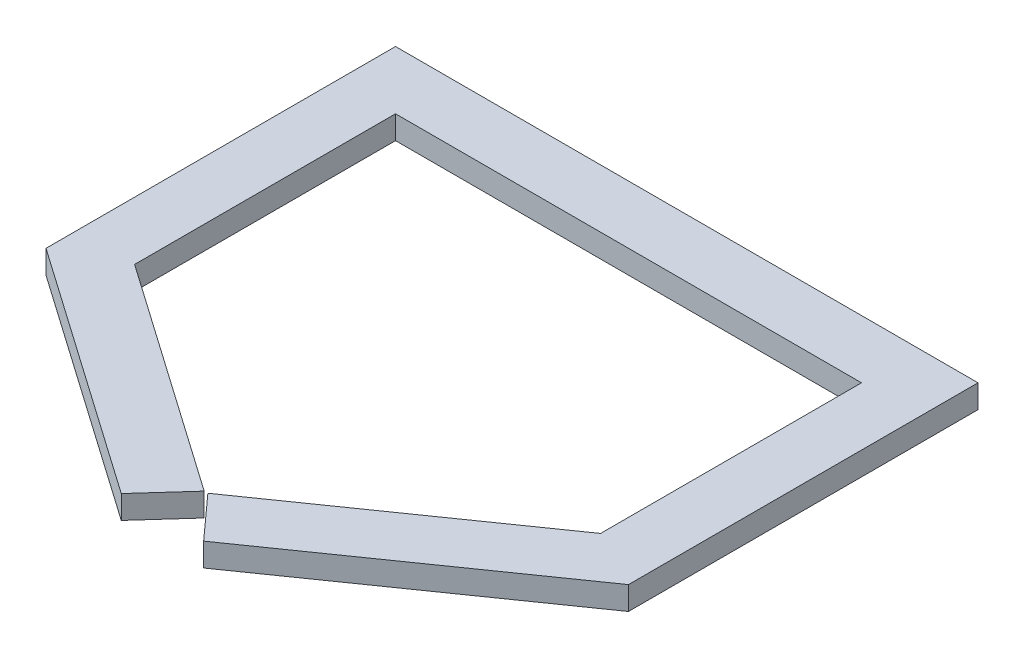
ISO-10303-21;
HEADER;
FILE_DESCRIPTION(('STEP AP214'),'2;1');
FILE_NAME('part.step','',(''),(''),'','','');
FILE_SCHEMA(('AUTOMOTIVE_DESIGN { 1 0 10303 214 1 1 1 1 }'));
ENDSEC;
DATA;
#1=APPLICATION_CONTEXT('core data for automotive mechanical design processes');
#2=APPLICATION_PROTOCOL_DEFINITION('international standard','automotive_design',2000,#1);
#3=PRODUCT_CONTEXT('',#1,'mechanical');
#4=PRODUCT('Part','Part','',(#3));
#5=PRODUCT_RELATED_PRODUCT_CATEGORY('part','',(#4));
#6=PRODUCT_DEFINITION_FORMATION('','',#4);
#7=PRODUCT_DEFINITION_CONTEXT('part definition',#1,'design');
#8=PRODUCT_DEFINITION('design','',#6,#7);
#9=PRODUCT_DEFINITION_SHAPE('','',#8);
#10=(LENGTH_UNIT() NAMED_UNIT(*) SI_UNIT(.MILLI.,.METRE.));
#11=(NAMED_UNIT(*) PLANE_ANGLE_UNIT() SI_UNIT($,.RADIAN.));
#12=(NAMED_UNIT(*) SI_UNIT($,.STERADIAN.) SOLID_ANGLE_UNIT());
#13=UNCERTAINTY_MEASURE_WITH_UNIT(LENGTH_MEASURE(1.E-05),#10,'distance_accuracy_value','');
#14=(GEOMETRIC_REPRESENTATION_CONTEXT(3) GLOBAL_UNCERTAINTY_ASSIGNED_CONTEXT((#13)) GLOBAL_UNIT_ASSIGNED_CONTEXT((#10,
#11,#12)) REPRESENTATION_CONTEXT('',''));
#15=CARTESIAN_POINT('',(0.,0.,0.));
#16=DIRECTION('',(0.,0.,1.));
#17=DIRECTION('',(1.,0.,0.));
#18=AXIS2_PLACEMENT_3D('',#15,#16,#17);
#19=CARTESIAN_POINT('',(-19.9955,2.,4.89453439352675));
#20=DIRECTION('',(-0.572898281778328,0.,0.819626475130861));
#21=DIRECTION('',(0.819626475130861,0.,0.572898281778328));
#22=AXIS2_PLACEMENT_3D('',#19,#20,#21);
#23=PLANE('',#22);
#24=DIRECTION('',(-0.819626475130861,0.,-0.572898281778328));
#25=VECTOR('',#24,1.);
#26=CARTESIAN_POINT('',(-19.9955,0.,4.89453439352675));
#27=LINE('',#26,#25);
#28=CARTESIAN_POINT('',(-0.158102293717703,0.,18.7603762199123));
#29=VERTEX_POINT('',#28);
#30=CARTESIAN_POINT('',(-19.9955,0.,4.89453439352675));
#31=VERTEX_POINT('',#30);
#32=EDGE_CURVE('E104',#29,#31,#27,.T.);
#33=ORIENTED_EDGE('',*,*,#32,.T.);
#34=DIRECTION('',(0.,-1.,0.));
#35=VECTOR('',#34,1.);
#36=CARTESIAN_POINT('',(-19.9955,2.,4.89453439352675));
#37=LINE('',#36,#35);
#38=CARTESIAN_POINT('',(-19.9955,2.,4.89453439352675));
#39=VERTEX_POINT('',#38);
#40=EDGE_CURVE('E11',#39,#31,#37,.T.);
#41=ORIENTED_EDGE('',*,*,#40,.F.);
#42=DIRECTION('',(-0.819626475130861,0.,-0.572898281778327));
#43=VECTOR('',#42,1.);
#44=CARTESIAN_POINT('',(-1.9612805390056,2.,17.5));
#45=LINE('',#44,#43);
#46=CARTESIAN_POINT('',(-0.158102293717703,2.,18.7603762199123));
#47=VERTEX_POINT('',#46);
#48=EDGE_CURVE('E110',#47,#39,#45,.T.);
#49=ORIENTED_EDGE('',*,*,#48,.F.);
#50=DIRECTION('',(0.,-1.,0.));
#51=VECTOR('',#50,1.);
#52=CARTESIAN_POINT('',(-0.158102293717703,2.,18.7603762199123));
#53=LINE('',#52,#51);
#54=EDGE_CURVE('E160',#47,#29,#53,.T.);
#55=ORIENTED_EDGE('',*,*,#54,.T.);
#56=EDGE_LOOP('',(#33,#41,#49,#55));
#57=FACE_BOUND('',#56,.T.);
#58=ADVANCED_FACE('F39',(#57),#23,.F.);
#59=CARTESIAN_POINT('',(-19.9955,2.,-17.5));
#60=DIRECTION('',(-1.,0.,0.));
#61=DIRECTION('',(0.,0.,1.));
#62=AXIS2_PLACEMENT_3D('',#59,#60,#61);
#63=PLANE('',#62);
#64=DIRECTION('',(0.,0.,-1.));
#65=VECTOR('',#64,1.);
#66=CARTESIAN_POINT('',(-19.9955,0.,-17.5));
#67=LINE('',#66,#65);
#68=CARTESIAN_POINT('',(-19.9955,0.,-17.5));
#69=VERTEX_POINT('',#68);
#70=EDGE_CURVE('E166',#31,#69,#67,.T.);
#71=ORIENTED_EDGE('',*,*,#70,.T.);
#72=DIRECTION('',(0.,-1.,0.));
#73=VECTOR('',#72,1.);
#74=CARTESIAN_POINT('',(-19.9955,2.,-17.5));
#75=LINE('',#74,#73);
#76=CARTESIAN_POINT('',(-19.9955,2.,-17.5));
#77=VERTEX_POINT('',#76);
#78=EDGE_CURVE('E48',#77,#69,#75,.T.);
#79=ORIENTED_EDGE('',*,*,#78,.F.);
#80=DIRECTION('',(0.,0.,-1.));
#81=VECTOR('',#80,1.);
#82=CARTESIAN_POINT('',(-19.9955,2.,-17.5));
#83=LINE('',#82,#81);
#84=EDGE_CURVE('E282',#39,#77,#83,.T.);
#85=ORIENTED_EDGE('',*,*,#84,.F.);
#86=ORIENTED_EDGE('',*,*,#40,.T.);
#87=EDGE_LOOP('',(#71,#79,#85,#86));
#88=FACE_BOUND('',#87,.T.);
#89=ADVANCED_FACE('F287',(#88),#63,.F.);
#90=CARTESIAN_POINT('',(-19.9955,2.,-17.5));
#91=DIRECTION('',(0.,0.,-1.));
#92=DIRECTION('',(-1.,0.,0.));
#93=AXIS2_PLACEMENT_3D('',#90,#91,#92);
#94=PLANE('',#93);
#95=DIRECTION('',(1.,0.,0.));
#96=VECTOR('',#95,1.);
#97=CARTESIAN_POINT('',(-19.9955,0.,-17.5));
#98=LINE('',#97,#96);
#99=CARTESIAN_POINT('',(20.,0.,-17.5));
#100=VERTEX_POINT('',#99);
#101=EDGE_CURVE('E169',#69,#100,#98,.T.);
#102=ORIENTED_EDGE('',*,*,#101,.T.);
#103=DIRECTION('',(0.,-1.,0.));
#104=VECTOR('',#103,1.);
#105=CARTESIAN_POINT('',(20.,2.,-17.5));
#106=LINE('',#105,#104);
#107=CARTESIAN_POINT('',(20.,2.,-17.5));
#108=VERTEX_POINT('',#107);
#109=EDGE_CURVE('E225',#108,#100,#106,.T.);
#110=ORIENTED_EDGE('',*,*,#109,.F.);
#111=DIRECTION('',(1.,0.,0.));
#112=VECTOR('',#111,1.);
#113=CARTESIAN_POINT('',(-19.9955,2.,-17.5));
#114=LINE('',#113,#112);
#115=EDGE_CURVE('E236',#77,#108,#114,.T.);
#116=ORIENTED_EDGE('',*,*,#115,.F.);
#117=ORIENTED_EDGE('',*,*,#78,.T.);
#118=EDGE_LOOP('',(#102,#110,#116,#117));
#119=FACE_BOUND('',#118,.T.);
#120=ADVANCED_FACE('F234',(#119),#94,.F.);
#121=CARTESIAN_POINT('',(20.,2.,-17.5));
#122=DIRECTION('',(1.,0.,0.));
#123=DIRECTION('',(0.,0.,-1.));
#124=AXIS2_PLACEMENT_3D('',#121,#122,#123);
#125=PLANE('',#124);
#126=DIRECTION('',(0.,0.,1.));
#127=VECTOR('',#126,1.);
#128=CARTESIAN_POINT('',(20.,0.,-17.5));
#129=LINE('',#128,#127);
#130=CARTESIAN_POINT('',(20.,0.,4.89422142863211));
#131=VERTEX_POINT('',#130);
#132=EDGE_CURVE('E172',#100,#131,#129,.T.);
#133=ORIENTED_EDGE('',*,*,#132,.T.);
#134=DIRECTION('',(0.,-1.,0.));
#135=VECTOR('',#134,1.);
#136=CARTESIAN_POINT('',(20.,2.,4.89422142863211));
#137=LINE('',#136,#135);
#138=CARTESIAN_POINT('',(20.,2.,4.89422142863211));
#139=VERTEX_POINT('',#138);
#140=EDGE_CURVE('E221',#139,#131,#137,.T.);
#141=ORIENTED_EDGE('',*,*,#140,.F.);
#142=DIRECTION('',(0.,0.,1.));
#143=VECTOR('',#142,1.);
#144=CARTESIAN_POINT('',(20.,2.,-17.5));
#145=LINE('',#144,#143);
#146=EDGE_CURVE('E254',#108,#139,#145,.T.);
#147=ORIENTED_EDGE('',*,*,#146,.F.);
#148=ORIENTED_EDGE('',*,*,#109,.T.);
#149=EDGE_LOOP('',(#133,#141,#147,#148));
#150=FACE_BOUND('',#149,.T.);
#151=ADVANCED_FACE('F244',(#150),#125,.F.);
#152=CARTESIAN_POINT('',(1.96155105699159,2.,17.5));
#153=DIRECTION('',(0.572817586887448,0.,0.819682872916374));
#154=DIRECTION('',(0.819682872916374,0.,-0.572817586887448));
#155=AXIS2_PLACEMENT_3D('',#152,#153,#154);
#156=PLANE('',#155);
#157=DIRECTION('',(-0.819682872916374,0.,0.572817586887448));
#158=VECTOR('',#157,1.);
#159=CARTESIAN_POINT('',(1.96155105699159,0.,17.5));
#160=LINE('',#159,#158);
#161=CARTESIAN_POINT('',(0.157994698837727,0.,18.7603762199123));
#162=VERTEX_POINT('',#161);
#163=EDGE_CURVE('E176',#131,#162,#160,.T.);
#164=ORIENTED_EDGE('',*,*,#163,.T.);
#165=DIRECTION('',(0.,-1.,0.));
#166=VECTOR('',#165,1.);
#167=CARTESIAN_POINT('',(0.157994698837727,2.,18.7603762199123));
#168=LINE('',#167,#166);
#169=CARTESIAN_POINT('',(0.157994698837727,2.,18.7603762199123));
#170=VERTEX_POINT('',#169);
#171=EDGE_CURVE('E217',#170,#162,#168,.T.);
#172=ORIENTED_EDGE('',*,*,#171,.F.);
#173=DIRECTION('',(-0.819682872916375,0.,0.572817586887447));
#174=VECTOR('',#173,1.);
#175=CARTESIAN_POINT('',(1.96155105699159,2.,17.5));
#176=LINE('',#175,#174);
#177=EDGE_CURVE('E250',#139,#170,#176,.T.);
#178=ORIENTED_EDGE('',*,*,#177,.F.);
#179=ORIENTED_EDGE('',*,*,#140,.T.);
#180=EDGE_LOOP('',(#164,#172,#178,#179));
#181=FACE_BOUND('',#180,.T.);
#182=ADVANCED_FACE('F248',(#181),#156,.F.);
#183=CARTESIAN_POINT('',(0.157994698837727,2.,18.7603762199123));
#184=DIRECTION('',(0.742124300269146,0.,-0.670262279223611));
#185=DIRECTION('',(-0.670262279223611,0.,-0.742124300269146));
#186=AXIS2_PLACEMENT_3D('',#183,#184,#185);
#187=PLANE('',#186);
#188=DIRECTION('',(0.670262279223611,0.,0.742124300269146));
#189=VECTOR('',#188,1.);
#190=CARTESIAN_POINT('',(0.157994698837727,0.,18.7603762199123));
#191=LINE('',#190,#189);
#192=CARTESIAN_POINT('',(3.5355,0.,22.5));
#193=VERTEX_POINT('',#192);
#194=EDGE_CURVE('E179',#162,#193,#191,.T.);
#195=ORIENTED_EDGE('',*,*,#194,.T.);
#196=DIRECTION('',(0.,-1.,0.));
#197=VECTOR('',#196,1.);
#198=CARTESIAN_POINT('',(3.5355,2.,22.5));
#199=LINE('',#198,#197);
#200=CARTESIAN_POINT('',(3.5355,2.,22.5));
#201=VERTEX_POINT('',#200);
#202=EDGE_CURVE('E213',#201,#193,#199,.T.);
#203=ORIENTED_EDGE('',*,*,#202,.F.);
#204=DIRECTION('',(0.670262279223611,0.,0.742124300269146));
#205=VECTOR('',#204,1.);
#206=CARTESIAN_POINT('',(0.157994698837727,2.,18.7603762199123));
#207=LINE('',#206,#205);
#208=EDGE_CURVE('E253',#170,#201,#207,.T.);
#209=ORIENTED_EDGE('',*,*,#208,.F.);
#210=ORIENTED_EDGE('',*,*,#171,.T.);
#211=EDGE_LOOP('',(#195,#203,#209,#210));
#212=FACE_BOUND('',#211,.T.);
#213=ADVANCED_FACE('F299',(#212),#187,.F.);
#214=CARTESIAN_POINT('',(3.5355,2.,22.5));
#215=DIRECTION('',(-0.572817586887447,0.,-0.819682872916375));
#216=DIRECTION('',(-0.819682872916375,0.,0.572817586887447));
#217=AXIS2_PLACEMENT_3D('',#214,#215,#216);
#218=PLANE('',#217);
#219=DIRECTION('',(0.819682872916375,0.,-0.572817586887447));
#220=VECTOR('',#219,1.);
#221=CARTESIAN_POINT('',(3.5355,0.,22.5));
#222=LINE('',#221,#220);
#223=CARTESIAN_POINT('',(25.,0.,7.5));
#224=VERTEX_POINT('',#223);
#225=EDGE_CURVE('E182',#193,#224,#222,.T.);
#226=ORIENTED_EDGE('',*,*,#225,.T.);
#227=DIRECTION('',(0.,-1.,0.));
#228=VECTOR('',#227,1.);
#229=CARTESIAN_POINT('',(25.,2.,7.5));
#230=LINE('',#229,#228);
#231=CARTESIAN_POINT('',(25.,2.,7.5));
#232=VERTEX_POINT('',#231);
#233=EDGE_CURVE('E209',#232,#224,#230,.T.);
#234=ORIENTED_EDGE('',*,*,#233,.F.);
#235=DIRECTION('',(0.819682872916375,0.,-0.572817586887447));
#236=VECTOR('',#235,1.);
#237=CARTESIAN_POINT('',(3.5355,2.,22.5));
#238=LINE('',#237,#236);
#239=EDGE_CURVE('E258',#201,#232,#238,.T.);
#240=ORIENTED_EDGE('',*,*,#239,.F.);
#241=ORIENTED_EDGE('',*,*,#202,.T.);
#242=EDGE_LOOP('',(#226,#234,#240,#241));
#243=FACE_BOUND('',#242,.T.);
#244=ADVANCED_FACE('F302',(#243),#218,.F.);
#245=CARTESIAN_POINT('',(25.,2.,-22.5));
#246=DIRECTION('',(-1.,0.,0.));
#247=DIRECTION('',(0.,0.,1.));
#248=AXIS2_PLACEMENT_3D('',#245,#246,#247);
#249=PLANE('',#248);
#250=DIRECTION('',(0.,0.,-1.));
#251=VECTOR('',#250,1.);
#252=CARTESIAN_POINT('',(25.,0.,-22.5));
#253=LINE('',#252,#251);
#254=CARTESIAN_POINT('',(25.,0.,-22.5));
#255=VERTEX_POINT('',#254);
#256=EDGE_CURVE('E185',#224,#255,#253,.T.);
#257=ORIENTED_EDGE('',*,*,#256,.T.);
#258=DIRECTION('',(0.,-1.,0.));
#259=VECTOR('',#258,1.);
#260=CARTESIAN_POINT('',(25.,2.,-22.5));
#261=LINE('',#260,#259);
#262=CARTESIAN_POINT('',(25.,2.,-22.5));
#263=VERTEX_POINT('',#262);
#264=EDGE_CURVE('E205',#263,#255,#261,.T.);
#265=ORIENTED_EDGE('',*,*,#264,.F.);
#266=DIRECTION('',(0.,0.,-1.));
#267=VECTOR('',#266,1.);
#268=CARTESIAN_POINT('',(25.,2.,-22.5));
#269=LINE('',#268,#267);
#270=EDGE_CURVE('E265',#232,#263,#269,.T.);
#271=ORIENTED_EDGE('',*,*,#270,.F.);
#272=ORIENTED_EDGE('',*,*,#233,.T.);
#273=EDGE_LOOP('',(#257,#265,#271,#272));
#274=FACE_BOUND('',#273,.T.);
#275=ADVANCED_FACE('F273',(#274),#249,.F.);
#276=CARTESIAN_POINT('',(-24.9955,2.,-22.5));
#277=DIRECTION('',(0.,0.,1.));
#278=DIRECTION('',(1.,0.,0.));
#279=AXIS2_PLACEMENT_3D('',#276,#277,#278);
#280=PLANE('',#279);
#281=DIRECTION('',(-1.,0.,0.));
#282=VECTOR('',#281,1.);
#283=CARTESIAN_POINT('',(-24.9955,0.,-22.5));
#284=LINE('',#283,#282);
#285=CARTESIAN_POINT('',(-24.9955,0.,-22.5));
#286=VERTEX_POINT('',#285);
#287=EDGE_CURVE('E188',#255,#286,#284,.T.);
#288=ORIENTED_EDGE('',*,*,#287,.T.);
#289=DIRECTION('',(0.,-1.,0.));
#290=VECTOR('',#289,1.);
#291=CARTESIAN_POINT('',(-24.9955,2.,-22.5));
#292=LINE('',#291,#290);
#293=CARTESIAN_POINT('',(-24.9955,2.,-22.5));
#294=VERTEX_POINT('',#293);
#295=EDGE_CURVE('E153',#294,#286,#292,.T.);
#296=ORIENTED_EDGE('',*,*,#295,.F.);
#297=DIRECTION('',(-1.,0.,0.));
#298=VECTOR('',#297,1.);
#299=CARTESIAN_POINT('',(-24.9955,2.,-22.5));
#300=LINE('',#299,#298);
#301=EDGE_CURVE('E142',#263,#294,#300,.T.);
#302=ORIENTED_EDGE('',*,*,#301,.F.);
#303=ORIENTED_EDGE('',*,*,#264,.T.);
#304=EDGE_LOOP('',(#288,#296,#302,#303));
#305=FACE_BOUND('',#304,.T.);
#306=ADVANCED_FACE('F277',(#305),#280,.F.);
#307=CARTESIAN_POINT('',(-24.9955,2.,-22.5));
#308=DIRECTION('',(1.,0.,0.));
#309=DIRECTION('',(0.,0.,-1.));
#310=AXIS2_PLACEMENT_3D('',#307,#308,#309);
#311=PLANE('',#310);
#312=DIRECTION('',(0.,0.,1.));
#313=VECTOR('',#312,1.);
#314=CARTESIAN_POINT('',(-24.9955,0.,-22.5));
#315=LINE('',#314,#313);
#316=CARTESIAN_POINT('',(-24.9955,0.,7.5));
#317=VERTEX_POINT('',#316);
#318=EDGE_CURVE('E151',#286,#317,#315,.T.);
#319=ORIENTED_EDGE('',*,*,#318,.T.);
#320=DIRECTION('',(0.,-1.,0.));
#321=VECTOR('',#320,1.);
#322=CARTESIAN_POINT('',(-24.9955,2.,7.5));
#323=LINE('',#322,#321);
#324=CARTESIAN_POINT('',(-24.9955,2.,7.5));
#325=VERTEX_POINT('',#324);
#326=EDGE_CURVE('E148',#325,#317,#323,.T.);
#327=ORIENTED_EDGE('',*,*,#326,.F.);
#328=DIRECTION('',(0.,0.,1.));
#329=VECTOR('',#328,1.);
#330=CARTESIAN_POINT('',(-24.9955,2.,-22.5));
#331=LINE('',#330,#329);
#332=EDGE_CURVE('E136',#294,#325,#331,.T.);
#333=ORIENTED_EDGE('',*,*,#332,.F.);
#334=ORIENTED_EDGE('',*,*,#295,.T.);
#335=EDGE_LOOP('',(#319,#327,#333,#334));
#336=FACE_BOUND('',#335,.T.);
#337=ADVANCED_FACE('F149',(#336),#311,.F.);
#338=CARTESIAN_POINT('',(-24.9955,2.,7.5));
#339=DIRECTION('',(0.572898281778328,0.,-0.819626475130861));
#340=DIRECTION('',(-0.819626475130861,0.,-0.572898281778328));
#341=AXIS2_PLACEMENT_3D('',#338,#339,#340);
#342=PLANE('',#341);
#343=DIRECTION('',(0.819626475130861,0.,0.572898281778328));
#344=VECTOR('',#343,1.);
#345=CARTESIAN_POINT('',(-24.9955,0.,7.5));
#346=LINE('',#345,#344);
#347=CARTESIAN_POINT('',(-3.53549999999999,0.,22.5));
#348=VERTEX_POINT('',#347);
#349=EDGE_CURVE('E97',#317,#348,#346,.T.);
#350=ORIENTED_EDGE('',*,*,#349,.T.);
#351=DIRECTION('',(0.,-1.,0.));
#352=VECTOR('',#351,1.);
#353=CARTESIAN_POINT('',(-3.53549999999999,2.,22.5));
#354=LINE('',#353,#352);
#355=CARTESIAN_POINT('',(-3.53549999999999,2.,22.5));
#356=VERTEX_POINT('',#355);
#357=EDGE_CURVE('E154',#356,#348,#354,.T.);
#358=ORIENTED_EDGE('',*,*,#357,.F.);
#359=DIRECTION('',(0.819626475130861,0.,0.572898281778328));
#360=VECTOR('',#359,1.);
#361=CARTESIAN_POINT('',(-24.9955,2.,7.5));
#362=LINE('',#361,#360);
#363=EDGE_CURVE('E140',#325,#356,#362,.T.);
#364=ORIENTED_EDGE('',*,*,#363,.F.);
#365=ORIENTED_EDGE('',*,*,#326,.T.);
#366=EDGE_LOOP('',(#350,#358,#364,#365));
#367=FACE_BOUND('',#366,.T.);
#368=ADVANCED_FACE('F156',(#367),#342,.F.);
#369=CARTESIAN_POINT('',(-0.158102293717703,2.,18.7603762199123));
#370=DIRECTION('',(-0.742134921239146,0.,-0.670250519341363));
#371=DIRECTION('',(-0.670250519341363,0.,0.742134921239146));
#372=AXIS2_PLACEMENT_3D('',#369,#370,#371);
#373=PLANE('',#372);
#374=DIRECTION('',(0.670250519341363,0.,-0.742134921239146));
#375=VECTOR('',#374,1.);
#376=CARTESIAN_POINT('',(-0.158102293717703,0.,18.7603762199123));
#377=LINE('',#376,#375);
#378=EDGE_CURVE('E195',#348,#29,#377,.T.);
#379=ORIENTED_EDGE('',*,*,#378,.T.);
#380=ORIENTED_EDGE('',*,*,#54,.F.);
#381=DIRECTION('',(0.670250519341363,0.,-0.742134921239146));
#382=VECTOR('',#381,1.);
#383=CARTESIAN_POINT('',(-0.158102293717703,2.,18.7603762199123));
#384=LINE('',#383,#382);
#385=EDGE_CURVE('E56',#356,#47,#384,.T.);
#386=ORIENTED_EDGE('',*,*,#385,.F.);
#387=ORIENTED_EDGE('',*,*,#357,.T.);
#388=EDGE_LOOP('',(#379,#380,#386,#387));
#389=FACE_BOUND('',#388,.T.);
#390=ADVANCED_FACE('F279',(#389),#373,.F.);
#391=CARTESIAN_POINT('',(0.,2.,0.));
#392=DIRECTION('',(0.,-1.,0.));
#393=DIRECTION('',(0.,0.,-1.));
#394=AXIS2_PLACEMENT_3D('',#391,#392,#393);
#395=PLANE('',#394);
#396=ORIENTED_EDGE('',*,*,#48,.T.);
#397=ORIENTED_EDGE('',*,*,#84,.T.);
#398=ORIENTED_EDGE('',*,*,#115,.T.);
#399=ORIENTED_EDGE('',*,*,#146,.T.);
#400=ORIENTED_EDGE('',*,*,#177,.T.);
#401=ORIENTED_EDGE('',*,*,#208,.T.);
#402=ORIENTED_EDGE('',*,*,#239,.T.);
#403=ORIENTED_EDGE('',*,*,#270,.T.);
#404=ORIENTED_EDGE('',*,*,#301,.T.);
#405=ORIENTED_EDGE('',*,*,#332,.T.);
#406=ORIENTED_EDGE('',*,*,#363,.T.);
#407=ORIENTED_EDGE('',*,*,#385,.T.);
#408=EDGE_LOOP('',(#396,#397,#398,#399,#400,#401,#402,#403,#404,#405,#406,#407));
#409=FACE_BOUND('',#408,.T.);
#410=ADVANCED_FACE('F138',(#409),#395,.F.);
#411=CARTESIAN_POINT('',(0.,0.,0.));
#412=DIRECTION('',(0.,-1.,0.));
#413=DIRECTION('',(0.,0.,-1.));
#414=AXIS2_PLACEMENT_3D('',#411,#412,#413);
#415=PLANE('',#414);
#416=ORIENTED_EDGE('',*,*,#32,.F.);
#417=ORIENTED_EDGE('',*,*,#378,.F.);
#418=ORIENTED_EDGE('',*,*,#349,.F.);
#419=ORIENTED_EDGE('',*,*,#318,.F.);
#420=ORIENTED_EDGE('',*,*,#287,.F.);
#421=ORIENTED_EDGE('',*,*,#256,.F.);
#422=ORIENTED_EDGE('',*,*,#225,.F.);
#423=ORIENTED_EDGE('',*,*,#194,.F.);
#424=ORIENTED_EDGE('',*,*,#163,.F.);
#425=ORIENTED_EDGE('',*,*,#132,.F.);
#426=ORIENTED_EDGE('',*,*,#101,.F.);
#427=ORIENTED_EDGE('',*,*,#70,.F.);
#428=EDGE_LOOP('',(#416,#417,#418,#419,#420,#421,#422,#423,#424,#425,#426,#427));
#429=FACE_BOUND('',#428,.T.);
#430=ADVANCED_FACE('F240',(#429),#415,.T.);
#431=CLOSED_SHELL('',(#58,#89,#120,#151,#182,#213,#244,#275,#306,#337,#368,#390,#410,#430));
#432=MANIFOLD_SOLID_BREP('B2',#431);
#433=ADVANCED_BREP_SHAPE_REPRESENTATION('',(#18,#432),#14);
#434=SHAPE_DEFINITION_REPRESENTATION(#9,#433);
ENDSEC;
END-ISO-10303-21;
